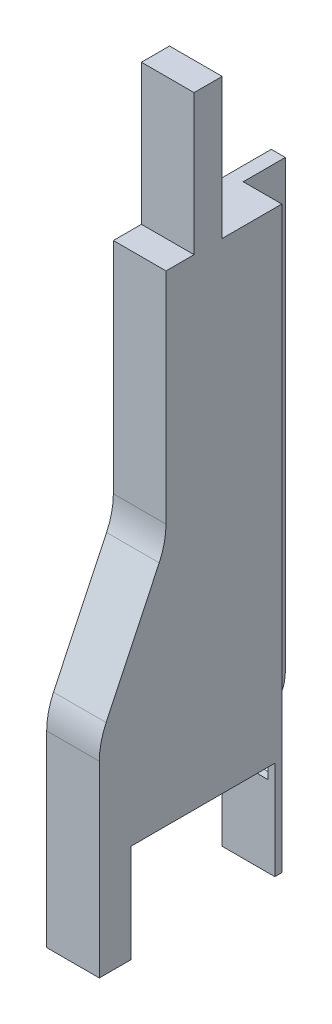
ISO-10303-21;
HEADER;
FILE_DESCRIPTION(('STEP AP214'),'2;1');
FILE_NAME('part.step','',(''),(''),'','','');
FILE_SCHEMA(('AUTOMOTIVE_DESIGN { 1 0 10303 214 1 1 1 1 }'));
ENDSEC;
DATA;
#1=APPLICATION_CONTEXT('core data for automotive mechanical design processes');
#2=APPLICATION_PROTOCOL_DEFINITION('international standard','automotive_design',2000,#1);
#3=PRODUCT_CONTEXT('',#1,'mechanical');
#4=PRODUCT('Part','Part','',(#3));
#5=PRODUCT_RELATED_PRODUCT_CATEGORY('part','',(#4));
#6=PRODUCT_DEFINITION_FORMATION('','',#4);
#7=PRODUCT_DEFINITION_CONTEXT('part definition',#1,'design');
#8=PRODUCT_DEFINITION('design','',#6,#7);
#9=PRODUCT_DEFINITION_SHAPE('','',#8);
#10=(LENGTH_UNIT() NAMED_UNIT(*) SI_UNIT(.MILLI.,.METRE.));
#11=(NAMED_UNIT(*) PLANE_ANGLE_UNIT() SI_UNIT($,.RADIAN.));
#12=(NAMED_UNIT(*) SI_UNIT($,.STERADIAN.) SOLID_ANGLE_UNIT());
#13=UNCERTAINTY_MEASURE_WITH_UNIT(LENGTH_MEASURE(1.E-05),#10,'distance_accuracy_value','');
#14=(GEOMETRIC_REPRESENTATION_CONTEXT(3) GLOBAL_UNCERTAINTY_ASSIGNED_CONTEXT((#13)) GLOBAL_UNIT_ASSIGNED_CONTEXT((#10,
#11,#12)) REPRESENTATION_CONTEXT('',''));
#15=CARTESIAN_POINT('',(0.,0.,0.));
#16=DIRECTION('',(0.,0.,1.));
#17=DIRECTION('',(1.,0.,0.));
#18=AXIS2_PLACEMENT_3D('',#15,#16,#17);
#19=CARTESIAN_POINT('',(0.,0.,26.));
#20=DIRECTION('',(0.,0.,1.));
#21=DIRECTION('',(1.,0.,0.));
#22=AXIS2_PLACEMENT_3D('',#19,#20,#21);
#23=PLANE('',#22);
#24=DIRECTION('',(0.,-1.,0.));
#25=VECTOR('',#24,1.);
#26=CARTESIAN_POINT('',(183.,0.,26.));
#27=LINE('',#26,#25);
#28=CARTESIAN_POINT('',(183.,-203.,26.));
#29=VERTEX_POINT('',#28);
#30=CARTESIAN_POINT('',(183.,-265.491389841085,26.));
#31=VERTEX_POINT('',#30);
#32=EDGE_CURVE('E226',#29,#31,#27,.T.);
#33=ORIENTED_EDGE('',*,*,#32,.F.);
#34=DIRECTION('',(-1.,0.,0.));
#35=VECTOR('',#34,1.);
#36=CARTESIAN_POINT('',(205.,-203.,26.));
#37=LINE('',#36,#35);
#38=CARTESIAN_POINT('',(168.,-203.,26.));
#39=VERTEX_POINT('',#38);
#40=EDGE_CURVE('E298',#29,#39,#37,.T.);
#41=ORIENTED_EDGE('',*,*,#40,.T.);
#42=DIRECTION('',(0.,-1.,0.));
#43=VECTOR('',#42,1.);
#44=CARTESIAN_POINT('',(168.,-19.9999999999999,26.));
#45=LINE('',#44,#43);
#46=CARTESIAN_POINT('',(168.,-265.491389841085,26.));
#47=VERTEX_POINT('',#46);
#48=EDGE_CURVE('E233',#39,#47,#45,.T.);
#49=ORIENTED_EDGE('',*,*,#48,.T.);
#50=DIRECTION('',(1.,0.,0.));
#51=VECTOR('',#50,1.);
#52=CARTESIAN_POINT('',(0.,-265.491389841085,26.));
#53=LINE('',#52,#51);
#54=EDGE_CURVE('E244',#47,#31,#53,.T.);
#55=ORIENTED_EDGE('',*,*,#54,.T.);
#56=EDGE_LOOP('',(#33,#41,#49,#55));
#57=FACE_BOUND('',#56,.T.);
#58=ADVANCED_FACE('F35',(#57),#23,.T.);
#59=CARTESIAN_POINT('',(168.,-19.9999999999999,26.));
#60=DIRECTION('',(1.,0.,0.));
#61=DIRECTION('',(0.,1.,0.));
#62=AXIS2_PLACEMENT_3D('',#59,#60,#61);
#63=PLANE('',#62);
#64=DIRECTION('',(0.,0.,-1.));
#65=VECTOR('',#64,1.);
#66=CARTESIAN_POINT('',(168.,-203.,0.));
#67=LINE('',#66,#65);
#68=CARTESIAN_POINT('',(168.,-203.,18.));
#69=VERTEX_POINT('',#68);
#70=EDGE_CURVE('E208',#39,#69,#67,.T.);
#71=ORIENTED_EDGE('',*,*,#70,.T.);
#72=DIRECTION('',(0.,1.,0.));
#73=VECTOR('',#72,1.);
#74=CARTESIAN_POINT('',(168.,0.,18.));
#75=LINE('',#74,#73);
#76=CARTESIAN_POINT('',(168.,-163.,18.));
#77=VERTEX_POINT('',#76);
#78=EDGE_CURVE('E497',#69,#77,#75,.T.);
#79=ORIENTED_EDGE('',*,*,#78,.T.);
#80=DIRECTION('',(0.,0.,-1.));
#81=VECTOR('',#80,1.);
#82=CARTESIAN_POINT('',(168.,-163.,0.));
#83=LINE('',#82,#81);
#84=CARTESIAN_POINT('',(168.,-163.,10.));
#85=VERTEX_POINT('',#84);
#86=EDGE_CURVE('E294',#77,#85,#83,.T.);
#87=ORIENTED_EDGE('',*,*,#86,.T.);
#88=DIRECTION('',(0.,-1.,0.));
#89=VECTOR('',#88,1.);
#90=CARTESIAN_POINT('',(168.,0.,9.99999999999998));
#91=LINE('',#90,#89);
#92=CARTESIAN_POINT('',(168.,-203.,10.));
#93=VERTEX_POINT('',#92);
#94=EDGE_CURVE('E218',#85,#93,#91,.T.);
#95=ORIENTED_EDGE('',*,*,#94,.T.);
#96=DIRECTION('',(0.,0.,-1.));
#97=VECTOR('',#96,1.);
#98=CARTESIAN_POINT('',(168.,-203.,0.));
#99=LINE('',#98,#97);
#100=CARTESIAN_POINT('',(168.,-203.,-19.));
#101=VERTEX_POINT('',#100);
#102=EDGE_CURVE('E200',#93,#101,#99,.T.);
#103=ORIENTED_EDGE('',*,*,#102,.T.);
#104=DIRECTION('',(0.,1.,0.));
#105=VECTOR('',#104,1.);
#106=CARTESIAN_POINT('',(168.,0.,-19.));
#107=LINE('',#106,#105);
#108=CARTESIAN_POINT('',(168.,-330.,-19.));
#109=VERTEX_POINT('',#108);
#110=EDGE_CURVE('E215',#109,#101,#107,.T.);
#111=ORIENTED_EDGE('',*,*,#110,.F.);
#112=CARTESIAN_POINT('',(168.,-330.,-9.));
#113=DIRECTION('',(1.,0.,0.));
#114=DIRECTION('',(0.,1.,0.));
#115=AXIS2_PLACEMENT_3D('',#112,#113,#114);
#116=CIRCLE('',#115,10.);
#117=CARTESIAN_POINT('',(168.,-338.,-15.));
#118=VERTEX_POINT('',#117);
#119=EDGE_CURVE('E242',#109,#118,#116,.F.);
#120=ORIENTED_EDGE('',*,*,#119,.T.);
#121=CARTESIAN_POINT('',(168.,-354.,-27.));
#122=DIRECTION('',(1.,0.,0.));
#123=DIRECTION('',(0.,1.,0.));
#124=AXIS2_PLACEMENT_3D('',#121,#122,#123);
#125=CIRCLE('',#124,20.);
#126=CARTESIAN_POINT('',(168.,-354.,-7.));
#127=VERTEX_POINT('',#126);
#128=EDGE_CURVE('E268',#118,#127,#125,.T.);
#129=ORIENTED_EDGE('',*,*,#128,.T.);
#130=DIRECTION('',(0.,1.,0.));
#131=VECTOR('',#130,1.);
#132=CARTESIAN_POINT('',(168.,-368.,-7.));
#133=LINE('',#132,#131);
#134=CARTESIAN_POINT('',(168.,-368.,-7.));
#135=VERTEX_POINT('',#134);
#136=EDGE_CURVE('E377',#135,#127,#133,.T.);
#137=ORIENTED_EDGE('',*,*,#136,.F.);
#138=DIRECTION('',(0.,0.,1.));
#139=VECTOR('',#138,1.);
#140=CARTESIAN_POINT('',(168.,-368.,0.));
#141=LINE('',#140,#139);
#142=CARTESIAN_POINT('',(168.,-368.,-5.));
#143=VERTEX_POINT('',#142);
#144=EDGE_CURVE('E374',#135,#143,#141,.T.);
#145=ORIENTED_EDGE('',*,*,#144,.T.);
#146=DIRECTION('',(0.,1.,0.));
#147=VECTOR('',#146,1.);
#148=CARTESIAN_POINT('',(168.,-368.,-5.));
#149=LINE('',#148,#147);
#150=CARTESIAN_POINT('',(168.,-340.,-5.));
#151=VERTEX_POINT('',#150);
#152=EDGE_CURVE('E382',#143,#151,#149,.T.);
#153=ORIENTED_EDGE('',*,*,#152,.T.);
#154=DIRECTION('',(0.,0.,-1.));
#155=VECTOR('',#154,1.);
#156=CARTESIAN_POINT('',(168.,-340.,26.));
#157=LINE('',#156,#155);
#158=CARTESIAN_POINT('',(168.,-340.,36.));
#159=VERTEX_POINT('',#158);
#160=EDGE_CURVE('E236',#159,#151,#157,.T.);
#161=ORIENTED_EDGE('',*,*,#160,.F.);
#162=DIRECTION('',(0.,1.,0.));
#163=VECTOR('',#162,1.);
#164=CARTESIAN_POINT('',(168.,-368.,36.));
#165=LINE('',#164,#163);
#166=CARTESIAN_POINT('',(168.,-368.,36.));
#167=VERTEX_POINT('',#166);
#168=EDGE_CURVE('E328',#167,#159,#165,.T.);
#169=ORIENTED_EDGE('',*,*,#168,.F.);
#170=DIRECTION('',(0.,0.,1.));
#171=VECTOR('',#170,1.);
#172=CARTESIAN_POINT('',(168.,-368.,0.));
#173=LINE('',#172,#171);
#174=CARTESIAN_POINT('',(168.,-368.,45.));
#175=VERTEX_POINT('',#174);
#176=EDGE_CURVE('E316',#167,#175,#173,.T.);
#177=ORIENTED_EDGE('',*,*,#176,.T.);
#178=DIRECTION('',(0.,-1.,0.));
#179=VECTOR('',#178,1.);
#180=CARTESIAN_POINT('',(168.,-310.,45.));
#181=LINE('',#180,#179);
#182=CARTESIAN_POINT('',(168.,-314.508610158915,45.));
#183=VERTEX_POINT('',#182);
#184=EDGE_CURVE('E331',#183,#175,#181,.T.);
#185=ORIENTED_EDGE('',*,*,#184,.F.);
#186=CARTESIAN_POINT('',(168.,-314.508610158915,25.));
#187=DIRECTION('',(1.,0.,0.));
#188=DIRECTION('',(0.,1.,0.));
#189=AXIS2_PLACEMENT_3D('',#186,#187,#188);
#190=CIRCLE('',#189,20.);
#191=CARTESIAN_POINT('',(168.,-305.927473867549,43.0655500870858));
#192=VERTEX_POINT('',#191);
#193=EDGE_CURVE('E256',#183,#192,#190,.F.);
#194=ORIENTED_EDGE('',*,*,#193,.T.);
#195=DIRECTION('',(0.,0.90327750435429,-0.429056814568288));
#196=VECTOR('',#195,1.);
#197=CARTESIAN_POINT('',(168.,-39.6277409484958,-83.4268230494646));
#198=LINE('',#197,#196);
#199=CARTESIAN_POINT('',(168.,-274.072526132451,27.9344499129142));
#200=VERTEX_POINT('',#199);
#201=EDGE_CURVE('E307',#192,#200,#198,.T.);
#202=ORIENTED_EDGE('',*,*,#201,.T.);
#203=CARTESIAN_POINT('',(168.,-265.491389841085,46.));
#204=DIRECTION('',(1.,0.,0.));
#205=DIRECTION('',(0.,1.,0.));
#206=AXIS2_PLACEMENT_3D('',#203,#204,#205);
#207=CIRCLE('',#206,20.);
#208=EDGE_CURVE('E260',#200,#47,#207,.T.);
#209=ORIENTED_EDGE('',*,*,#208,.T.);
#210=ORIENTED_EDGE('',*,*,#48,.F.);
#211=EDGE_LOOP('',(#71,#79,#87,#95,#103,#111,#120,#129,#137,#145,#153,#161,#169,#177,#185,#194,
#202,#209,#210));
#212=FACE_BOUND('',#211,.T.);
#213=ADVANCED_FACE('F213',(#212),#63,.F.);
#214=CARTESIAN_POINT('',(183.,0.,26.));
#215=DIRECTION('',(1.,0.,0.));
#216=DIRECTION('',(0.,1.,0.));
#217=AXIS2_PLACEMENT_3D('',#214,#215,#216);
#218=PLANE('',#217);
#219=DIRECTION('',(0.,-1.,0.));
#220=VECTOR('',#219,1.);
#221=CARTESIAN_POINT('',(183.,0.,18.));
#222=LINE('',#221,#220);
#223=CARTESIAN_POINT('',(183.,-163.,18.));
#224=VERTEX_POINT('',#223);
#225=CARTESIAN_POINT('',(183.,-203.,18.));
#226=VERTEX_POINT('',#225);
#227=EDGE_CURVE('E43',#224,#226,#222,.T.);
#228=ORIENTED_EDGE('',*,*,#227,.T.);
#229=DIRECTION('',(0.,0.,1.));
#230=VECTOR('',#229,1.);
#231=CARTESIAN_POINT('',(183.,-203.,26.));
#232=LINE('',#231,#230);
#233=EDGE_CURVE('E11',#226,#29,#232,.T.);
#234=ORIENTED_EDGE('',*,*,#233,.T.);
#235=ORIENTED_EDGE('',*,*,#32,.T.);
#236=CARTESIAN_POINT('',(183.,-265.491389841085,46.));
#237=DIRECTION('',(1.,0.,0.));
#238=DIRECTION('',(0.,1.,0.));
#239=AXIS2_PLACEMENT_3D('',#236,#237,#238);
#240=CIRCLE('',#239,20.);
#241=CARTESIAN_POINT('',(183.,-274.072526132451,27.9344499129142));
#242=VERTEX_POINT('',#241);
#243=EDGE_CURVE('E258',#31,#242,#240,.F.);
#244=ORIENTED_EDGE('',*,*,#243,.T.);
#245=DIRECTION('',(0.,0.90327750435429,-0.429056814568288));
#246=VECTOR('',#245,1.);
#247=CARTESIAN_POINT('',(183.,-39.6277409484958,-83.4268230494646));
#248=LINE('',#247,#246);
#249=CARTESIAN_POINT('',(183.,-305.927473867549,43.0655500870858));
#250=VERTEX_POINT('',#249);
#251=EDGE_CURVE('E306',#250,#242,#248,.T.);
#252=ORIENTED_EDGE('',*,*,#251,.F.);
#253=CARTESIAN_POINT('',(183.,-314.508610158915,25.));
#254=DIRECTION('',(1.,0.,0.));
#255=DIRECTION('',(0.,1.,0.));
#256=AXIS2_PLACEMENT_3D('',#253,#254,#255);
#257=CIRCLE('',#256,20.);
#258=CARTESIAN_POINT('',(183.,-314.508610158915,45.));
#259=VERTEX_POINT('',#258);
#260=EDGE_CURVE('E252',#250,#259,#257,.T.);
#261=ORIENTED_EDGE('',*,*,#260,.T.);
#262=DIRECTION('',(0.,-1.,0.));
#263=VECTOR('',#262,1.);
#264=CARTESIAN_POINT('',(183.,-310.,45.));
#265=LINE('',#264,#263);
#266=CARTESIAN_POINT('',(183.,-368.,45.));
#267=VERTEX_POINT('',#266);
#268=EDGE_CURVE('E330',#259,#267,#265,.T.);
#269=ORIENTED_EDGE('',*,*,#268,.T.);
#270=DIRECTION('',(0.,0.,-1.));
#271=VECTOR('',#270,1.);
#272=CARTESIAN_POINT('',(183.,-368.,0.));
#273=LINE('',#272,#271);
#274=CARTESIAN_POINT('',(183.,-368.,36.));
#275=VERTEX_POINT('',#274);
#276=EDGE_CURVE('E321',#267,#275,#273,.T.);
#277=ORIENTED_EDGE('',*,*,#276,.T.);
#278=DIRECTION('',(0.,1.,0.));
#279=VECTOR('',#278,1.);
#280=CARTESIAN_POINT('',(183.,-368.,36.));
#281=LINE('',#280,#279);
#282=CARTESIAN_POINT('',(183.,-340.,36.));
#283=VERTEX_POINT('',#282);
#284=EDGE_CURVE('E324',#275,#283,#281,.T.);
#285=ORIENTED_EDGE('',*,*,#284,.T.);
#286=DIRECTION('',(0.,0.,-1.));
#287=VECTOR('',#286,1.);
#288=CARTESIAN_POINT('',(183.,-340.,26.));
#289=LINE('',#288,#287);
#290=CARTESIAN_POINT('',(183.,-340.,-5.));
#291=VERTEX_POINT('',#290);
#292=EDGE_CURVE('E235',#283,#291,#289,.T.);
#293=ORIENTED_EDGE('',*,*,#292,.T.);
#294=DIRECTION('',(0.,1.,0.));
#295=VECTOR('',#294,1.);
#296=CARTESIAN_POINT('',(183.,-368.,-5.));
#297=LINE('',#296,#295);
#298=CARTESIAN_POINT('',(183.,-368.,-5.));
#299=VERTEX_POINT('',#298);
#300=EDGE_CURVE('E385',#299,#291,#297,.T.);
#301=ORIENTED_EDGE('',*,*,#300,.F.);
#302=DIRECTION('',(0.,0.,-1.));
#303=VECTOR('',#302,1.);
#304=CARTESIAN_POINT('',(183.,-368.,0.));
#305=LINE('',#304,#303);
#306=CARTESIAN_POINT('',(183.,-368.,-7.));
#307=VERTEX_POINT('',#306);
#308=EDGE_CURVE('E367',#299,#307,#305,.T.);
#309=ORIENTED_EDGE('',*,*,#308,.T.);
#310=DIRECTION('',(0.,-1.,0.));
#311=VECTOR('',#310,1.);
#312=CARTESIAN_POINT('',(183.,0.,-7.));
#313=LINE('',#312,#311);
#314=CARTESIAN_POINT('',(183.,-203.,-7.));
#315=VERTEX_POINT('',#314);
#316=EDGE_CURVE('E228',#315,#307,#313,.T.);
#317=ORIENTED_EDGE('',*,*,#316,.F.);
#318=DIRECTION('',(0.,0.,1.));
#319=VECTOR('',#318,1.);
#320=CARTESIAN_POINT('',(183.,-203.,26.));
#321=LINE('',#320,#319);
#322=CARTESIAN_POINT('',(183.,-203.,10.));
#323=VERTEX_POINT('',#322);
#324=EDGE_CURVE('E50',#315,#323,#321,.T.);
#325=ORIENTED_EDGE('',*,*,#324,.T.);
#326=DIRECTION('',(0.,1.,0.));
#327=VECTOR('',#326,1.);
#328=CARTESIAN_POINT('',(183.,0.,9.99999999999998));
#329=LINE('',#328,#327);
#330=CARTESIAN_POINT('',(183.,-163.,10.));
#331=VERTEX_POINT('',#330);
#332=EDGE_CURVE('E274',#323,#331,#329,.T.);
#333=ORIENTED_EDGE('',*,*,#332,.T.);
#334=DIRECTION('',(0.,0.,1.));
#335=VECTOR('',#334,1.);
#336=CARTESIAN_POINT('',(183.,-163.,26.));
#337=LINE('',#336,#335);
#338=EDGE_CURVE('E277',#331,#224,#337,.T.);
#339=ORIENTED_EDGE('',*,*,#338,.T.);
#340=EDGE_LOOP('',(#228,#234,#235,#244,#252,#261,#269,#277,#285,#293,#301,#309,#317,#325,#333,#339));
#341=FACE_BOUND('',#340,.T.);
#342=ADVANCED_FACE('F281',(#341),#218,.T.);
#343=CARTESIAN_POINT('',(172.,0.,-19.));
#344=DIRECTION('',(1.,0.,0.));
#345=DIRECTION('',(0.,1.,0.));
#346=AXIS2_PLACEMENT_3D('',#343,#344,#345);
#347=PLANE('',#346);
#348=DIRECTION('',(0.,1.,0.));
#349=VECTOR('',#348,1.);
#350=CARTESIAN_POINT('',(172.,0.,-19.));
#351=LINE('',#350,#349);
#352=CARTESIAN_POINT('',(172.,-330.,-19.));
#353=VERTEX_POINT('',#352);
#354=CARTESIAN_POINT('',(172.,-203.,-19.));
#355=VERTEX_POINT('',#354);
#356=EDGE_CURVE('E224',#353,#355,#351,.T.);
#357=ORIENTED_EDGE('',*,*,#356,.T.);
#358=DIRECTION('',(0.,0.,1.));
#359=VECTOR('',#358,1.);
#360=CARTESIAN_POINT('',(172.,-203.,-19.));
#361=LINE('',#360,#359);
#362=CARTESIAN_POINT('',(172.,-203.,-7.));
#363=VERTEX_POINT('',#362);
#364=EDGE_CURVE('E202',#355,#363,#361,.T.);
#365=ORIENTED_EDGE('',*,*,#364,.T.);
#366=DIRECTION('',(0.,1.,0.));
#367=VECTOR('',#366,1.);
#368=CARTESIAN_POINT('',(172.,0.,-7.));
#369=LINE('',#368,#367);
#370=CARTESIAN_POINT('',(172.,-354.,-7.));
#371=VERTEX_POINT('',#370);
#372=EDGE_CURVE('E58',#371,#363,#369,.T.);
#373=ORIENTED_EDGE('',*,*,#372,.F.);
#374=CARTESIAN_POINT('',(172.,-354.,-27.));
#375=DIRECTION('',(1.,0.,0.));
#376=DIRECTION('',(0.,1.,0.));
#377=AXIS2_PLACEMENT_3D('',#374,#375,#376);
#378=CIRCLE('',#377,20.);
#379=CARTESIAN_POINT('',(172.,-338.,-15.));
#380=VERTEX_POINT('',#379);
#381=EDGE_CURVE('E270',#371,#380,#378,.F.);
#382=ORIENTED_EDGE('',*,*,#381,.T.);
#383=CARTESIAN_POINT('',(172.,-330.,-9.));
#384=DIRECTION('',(1.,0.,0.));
#385=DIRECTION('',(0.,1.,0.));
#386=AXIS2_PLACEMENT_3D('',#383,#384,#385);
#387=CIRCLE('',#386,10.);
#388=EDGE_CURVE('E240',#380,#353,#387,.T.);
#389=ORIENTED_EDGE('',*,*,#388,.T.);
#390=EDGE_LOOP('',(#357,#365,#373,#382,#389));
#391=FACE_BOUND('',#390,.T.);
#392=ADVANCED_FACE('F409',(#391),#347,.T.);
#393=CARTESIAN_POINT('',(0.,0.,-19.));
#394=DIRECTION('',(0.,0.,1.));
#395=DIRECTION('',(1.,0.,0.));
#396=AXIS2_PLACEMENT_3D('',#393,#394,#395);
#397=PLANE('',#396);
#398=DIRECTION('',(-1.,0.,0.));
#399=VECTOR('',#398,1.);
#400=CARTESIAN_POINT('',(205.,-203.,-19.));
#401=LINE('',#400,#399);
#402=EDGE_CURVE('E197',#355,#101,#401,.T.);
#403=ORIENTED_EDGE('',*,*,#402,.F.);
#404=ORIENTED_EDGE('',*,*,#356,.F.);
#405=DIRECTION('',(-1.,0.,0.));
#406=VECTOR('',#405,1.);
#407=CARTESIAN_POINT('',(168.,-330.,-19.));
#408=LINE('',#407,#406);
#409=EDGE_CURVE('E223',#353,#109,#408,.T.);
#410=ORIENTED_EDGE('',*,*,#409,.T.);
#411=ORIENTED_EDGE('',*,*,#110,.T.);
#412=EDGE_LOOP('',(#403,#404,#410,#411));
#413=FACE_BOUND('',#412,.T.);
#414=ADVANCED_FACE('F221',(#413),#397,.F.);
#415=CARTESIAN_POINT('',(0.,0.,-7.));
#416=DIRECTION('',(0.,0.,1.));
#417=DIRECTION('',(1.,0.,0.));
#418=AXIS2_PLACEMENT_3D('',#415,#416,#417);
#419=PLANE('',#418);
#420=DIRECTION('',(0.,1.,0.));
#421=VECTOR('',#420,1.);
#422=CARTESIAN_POINT('',(174.5,-345.,-7.));
#423=LINE('',#422,#421);
#424=CARTESIAN_POINT('',(174.5,-345.,-7.));
#425=VERTEX_POINT('',#424);
#426=CARTESIAN_POINT('',(174.5,-340.,-7.));
#427=VERTEX_POINT('',#426);
#428=EDGE_CURVE('E357',#425,#427,#423,.T.);
#429=ORIENTED_EDGE('',*,*,#428,.F.);
#430=DIRECTION('',(-1.,0.,0.));
#431=VECTOR('',#430,1.);
#432=CARTESIAN_POINT('',(0.,-345.,-7.));
#433=LINE('',#432,#431);
#434=CARTESIAN_POINT('',(181.1,-345.,-7.));
#435=VERTEX_POINT('',#434);
#436=EDGE_CURVE('E341',#435,#425,#433,.T.);
#437=ORIENTED_EDGE('',*,*,#436,.F.);
#438=DIRECTION('',(0.,1.,0.));
#439=VECTOR('',#438,1.);
#440=CARTESIAN_POINT('',(181.1,-345.,-7.));
#441=LINE('',#440,#439);
#442=CARTESIAN_POINT('',(181.1,-340.,-7.));
#443=VERTEX_POINT('',#442);
#444=EDGE_CURVE('E354',#435,#443,#441,.T.);
#445=ORIENTED_EDGE('',*,*,#444,.T.);
#446=DIRECTION('',(-1.,0.,0.));
#447=VECTOR('',#446,1.);
#448=CARTESIAN_POINT('',(0.,-340.,-7.));
#449=LINE('',#448,#447);
#450=EDGE_CURVE('E348',#443,#427,#449,.T.);
#451=ORIENTED_EDGE('',*,*,#450,.T.);
#452=EDGE_LOOP('',(#429,#437,#445,#451));
#453=FACE_BOUND('',#452,.T.);
#454=DIRECTION('',(-1.,0.,0.));
#455=VECTOR('',#454,1.);
#456=CARTESIAN_POINT('',(0.,-203.,-7.));
#457=LINE('',#456,#455);
#458=EDGE_CURVE('E272',#315,#363,#457,.T.);
#459=ORIENTED_EDGE('',*,*,#458,.F.);
#460=ORIENTED_EDGE('',*,*,#316,.T.);
#461=DIRECTION('',(-1.,0.,0.));
#462=VECTOR('',#461,1.);
#463=CARTESIAN_POINT('',(0.,-368.,-7.));
#464=LINE('',#463,#462);
#465=EDGE_CURVE('E364',#307,#135,#464,.T.);
#466=ORIENTED_EDGE('',*,*,#465,.T.);
#467=ORIENTED_EDGE('',*,*,#136,.T.);
#468=DIRECTION('',(1.,0.,0.));
#469=VECTOR('',#468,1.);
#470=CARTESIAN_POINT('',(0.,-354.,-7.));
#471=LINE('',#470,#469);
#472=EDGE_CURVE('E266',#127,#371,#471,.T.);
#473=ORIENTED_EDGE('',*,*,#472,.T.);
#474=ORIENTED_EDGE('',*,*,#372,.T.);
#475=EDGE_LOOP('',(#459,#460,#466,#467,#473,#474));
#476=FACE_BOUND('',#475,.T.);
#477=ADVANCED_FACE('F390',(#453,#476),#419,.F.);
#478=CARTESIAN_POINT('',(183.,-340.,26.));
#479=DIRECTION('',(0.,-1.,0.));
#480=DIRECTION('',(0.,0.,-1.));
#481=AXIS2_PLACEMENT_3D('',#478,#479,#480);
#482=PLANE('',#481);
#483=ORIENTED_EDGE('',*,*,#292,.F.);
#484=DIRECTION('',(1.,0.,0.));
#485=VECTOR('',#484,1.);
#486=CARTESIAN_POINT('',(0.,-340.,36.));
#487=LINE('',#486,#485);
#488=EDGE_CURVE('E310',#159,#283,#487,.T.);
#489=ORIENTED_EDGE('',*,*,#488,.F.);
#490=ORIENTED_EDGE('',*,*,#160,.T.);
#491=DIRECTION('',(1.,0.,0.));
#492=VECTOR('',#491,1.);
#493=CARTESIAN_POINT('',(0.,-340.,-4.99999999999992));
#494=LINE('',#493,#492);
#495=CARTESIAN_POINT('',(174.5,-340.,-5.));
#496=VERTEX_POINT('',#495);
#497=EDGE_CURVE('E368',#151,#496,#494,.T.);
#498=ORIENTED_EDGE('',*,*,#497,.T.);
#499=DIRECTION('',(0.,0.,-1.));
#500=VECTOR('',#499,1.);
#501=CARTESIAN_POINT('',(174.5,-340.,0.));
#502=LINE('',#501,#500);
#503=EDGE_CURVE('E333',#496,#427,#502,.T.);
#504=ORIENTED_EDGE('',*,*,#503,.T.);
#505=ORIENTED_EDGE('',*,*,#450,.F.);
#506=DIRECTION('',(0.,0.,1.));
#507=VECTOR('',#506,1.);
#508=CARTESIAN_POINT('',(181.1,-340.,0.));
#509=LINE('',#508,#507);
#510=CARTESIAN_POINT('',(181.1,-340.,-5.));
#511=VERTEX_POINT('',#510);
#512=EDGE_CURVE('E339',#443,#511,#509,.T.);
#513=ORIENTED_EDGE('',*,*,#512,.T.);
#514=EDGE_CURVE('E363',#511,#291,#494,.T.);
#515=ORIENTED_EDGE('',*,*,#514,.T.);
#516=EDGE_LOOP('',(#483,#489,#490,#498,#504,#505,#513,#515));
#517=FACE_BOUND('',#516,.T.);
#518=ADVANCED_FACE('F420',(#517),#482,.T.);
#519=CARTESIAN_POINT('',(0.,-368.,-4.99999999999992));
#520=DIRECTION('',(0.,0.,1.));
#521=DIRECTION('',(1.,0.,0.));
#522=AXIS2_PLACEMENT_3D('',#519,#520,#521);
#523=PLANE('',#522);
#524=DIRECTION('',(-1.,0.,0.));
#525=VECTOR('',#524,1.);
#526=CARTESIAN_POINT('',(0.,-345.,-5.00000000000002));
#527=LINE('',#526,#525);
#528=CARTESIAN_POINT('',(181.1,-345.,-5.));
#529=VERTEX_POINT('',#528);
#530=CARTESIAN_POINT('',(174.5,-345.,-5.));
#531=VERTEX_POINT('',#530);
#532=EDGE_CURVE('E335',#529,#531,#527,.T.);
#533=ORIENTED_EDGE('',*,*,#532,.T.);
#534=DIRECTION('',(0.,1.,0.));
#535=VECTOR('',#534,1.);
#536=CARTESIAN_POINT('',(174.5,-345.,-5.));
#537=LINE('',#536,#535);
#538=EDGE_CURVE('E360',#531,#496,#537,.T.);
#539=ORIENTED_EDGE('',*,*,#538,.T.);
#540=ORIENTED_EDGE('',*,*,#497,.F.);
#541=ORIENTED_EDGE('',*,*,#152,.F.);
#542=DIRECTION('',(1.,0.,0.));
#543=VECTOR('',#542,1.);
#544=CARTESIAN_POINT('',(0.,-368.,-4.99999999999992));
#545=LINE('',#544,#543);
#546=EDGE_CURVE('E371',#143,#299,#545,.T.);
#547=ORIENTED_EDGE('',*,*,#546,.T.);
#548=ORIENTED_EDGE('',*,*,#300,.T.);
#549=ORIENTED_EDGE('',*,*,#514,.F.);
#550=DIRECTION('',(0.,1.,0.));
#551=VECTOR('',#550,1.);
#552=CARTESIAN_POINT('',(181.1,-345.,-5.));
#553=LINE('',#552,#551);
#554=EDGE_CURVE('E346',#529,#511,#553,.T.);
#555=ORIENTED_EDGE('',*,*,#554,.F.);
#556=EDGE_LOOP('',(#533,#539,#540,#541,#547,#548,#549,#555));
#557=FACE_BOUND('',#556,.T.);
#558=ADVANCED_FACE('F400',(#557),#523,.T.);
#559=CARTESIAN_POINT('',(0.,-330.,-9.));
#560=DIRECTION('',(1.,0.,0.));
#561=DIRECTION('',(0.,0.,-1.));
#562=AXIS2_PLACEMENT_3D('',#559,#560,#561);
#563=CYLINDRICAL_SURFACE('',#562,10.);
#564=ORIENTED_EDGE('',*,*,#388,.F.);
#565=DIRECTION('',(1.,0.,0.));
#566=VECTOR('',#565,1.);
#567=CARTESIAN_POINT('',(0.,-338.,-15.));
#568=LINE('',#567,#566);
#569=EDGE_CURVE('E263',#380,#118,#568,.F.);
#570=ORIENTED_EDGE('',*,*,#569,.T.);
#571=ORIENTED_EDGE('',*,*,#119,.F.);
#572=ORIENTED_EDGE('',*,*,#409,.F.);
#573=EDGE_LOOP('',(#564,#570,#571,#572));
#574=FACE_BOUND('',#573,.T.);
#575=ADVANCED_FACE('F411',(#574),#563,.T.);
#576=CARTESIAN_POINT('',(0.,-368.,0.));
#577=DIRECTION('',(0.,-1.,0.));
#578=DIRECTION('',(0.,0.,-1.));
#579=AXIS2_PLACEMENT_3D('',#576,#577,#578);
#580=PLANE('',#579);
#581=ORIENTED_EDGE('',*,*,#465,.F.);
#582=ORIENTED_EDGE('',*,*,#308,.F.);
#583=ORIENTED_EDGE('',*,*,#546,.F.);
#584=ORIENTED_EDGE('',*,*,#144,.F.);
#585=EDGE_LOOP('',(#581,#582,#583,#584));
#586=FACE_BOUND('',#585,.T.);
#587=ADVANCED_FACE('F394',(#586),#580,.T.);
#588=CARTESIAN_POINT('',(174.5,-345.,0.));
#589=DIRECTION('',(1.,0.,0.));
#590=DIRECTION('',(0.,0.,-1.));
#591=AXIS2_PLACEMENT_3D('',#588,#589,#590);
#592=PLANE('',#591);
#593=ORIENTED_EDGE('',*,*,#503,.F.);
#594=ORIENTED_EDGE('',*,*,#538,.F.);
#595=DIRECTION('',(0.,0.,-1.));
#596=VECTOR('',#595,1.);
#597=CARTESIAN_POINT('',(174.5,-345.,0.));
#598=LINE('',#597,#596);
#599=EDGE_CURVE('E338',#531,#425,#598,.T.);
#600=ORIENTED_EDGE('',*,*,#599,.T.);
#601=ORIENTED_EDGE('',*,*,#428,.T.);
#602=EDGE_LOOP('',(#593,#594,#600,#601));
#603=FACE_BOUND('',#602,.T.);
#604=ADVANCED_FACE('F418',(#603),#592,.T.);
#605=CARTESIAN_POINT('',(181.1,-345.,0.));
#606=DIRECTION('',(-1.,0.,0.));
#607=DIRECTION('',(0.,0.,1.));
#608=AXIS2_PLACEMENT_3D('',#605,#606,#607);
#609=PLANE('',#608);
#610=ORIENTED_EDGE('',*,*,#512,.F.);
#611=ORIENTED_EDGE('',*,*,#444,.F.);
#612=DIRECTION('',(0.,0.,1.));
#613=VECTOR('',#612,1.);
#614=CARTESIAN_POINT('',(181.1,-345.,0.));
#615=LINE('',#614,#613);
#616=EDGE_CURVE('E344',#435,#529,#615,.T.);
#617=ORIENTED_EDGE('',*,*,#616,.T.);
#618=ORIENTED_EDGE('',*,*,#554,.T.);
#619=EDGE_LOOP('',(#610,#611,#617,#618));
#620=FACE_BOUND('',#619,.T.);
#621=ADVANCED_FACE('F453',(#620),#609,.T.);
#622=CARTESIAN_POINT('',(0.,-345.,0.));
#623=DIRECTION('',(0.,-1.,0.));
#624=DIRECTION('',(0.,0.,-1.));
#625=AXIS2_PLACEMENT_3D('',#622,#623,#624);
#626=PLANE('',#625);
#627=ORIENTED_EDGE('',*,*,#532,.F.);
#628=ORIENTED_EDGE('',*,*,#616,.F.);
#629=ORIENTED_EDGE('',*,*,#436,.T.);
#630=ORIENTED_EDGE('',*,*,#599,.F.);
#631=EDGE_LOOP('',(#627,#628,#629,#630));
#632=FACE_BOUND('',#631,.T.);
#633=ADVANCED_FACE('F457',(#632),#626,.F.);
#634=CARTESIAN_POINT('',(0.,-310.,45.));
#635=DIRECTION('',(0.,0.,-1.));
#636=DIRECTION('',(-1.,0.,0.));
#637=AXIS2_PLACEMENT_3D('',#634,#635,#636);
#638=PLANE('',#637);
#639=ORIENTED_EDGE('',*,*,#268,.F.);
#640=DIRECTION('',(1.,0.,0.));
#641=VECTOR('',#640,1.);
#642=CARTESIAN_POINT('',(0.,-314.508610158915,45.));
#643=LINE('',#642,#641);
#644=EDGE_CURVE('E254',#259,#183,#643,.F.);
#645=ORIENTED_EDGE('',*,*,#644,.T.);
#646=ORIENTED_EDGE('',*,*,#184,.T.);
#647=DIRECTION('',(1.,0.,0.));
#648=VECTOR('',#647,1.);
#649=CARTESIAN_POINT('',(0.,-368.,45.));
#650=LINE('',#649,#648);
#651=EDGE_CURVE('E313',#175,#267,#650,.T.);
#652=ORIENTED_EDGE('',*,*,#651,.T.);
#653=EDGE_LOOP('',(#639,#645,#646,#652));
#654=FACE_BOUND('',#653,.T.);
#655=ADVANCED_FACE('F461',(#654),#638,.F.);
#656=CARTESIAN_POINT('',(0.,-368.,36.));
#657=DIRECTION('',(0.,0.,1.));
#658=DIRECTION('',(1.,0.,0.));
#659=AXIS2_PLACEMENT_3D('',#656,#657,#658);
#660=PLANE('',#659);
#661=ORIENTED_EDGE('',*,*,#488,.T.);
#662=ORIENTED_EDGE('',*,*,#284,.F.);
#663=DIRECTION('',(1.,0.,0.));
#664=VECTOR('',#663,1.);
#665=CARTESIAN_POINT('',(0.,-368.,36.));
#666=LINE('',#665,#664);
#667=EDGE_CURVE('E319',#167,#275,#666,.T.);
#668=ORIENTED_EDGE('',*,*,#667,.F.);
#669=ORIENTED_EDGE('',*,*,#168,.T.);
#670=EDGE_LOOP('',(#661,#662,#668,#669));
#671=FACE_BOUND('',#670,.T.);
#672=ADVANCED_FACE('F465',(#671),#660,.F.);
#673=CARTESIAN_POINT('',(0.,-368.,0.));
#674=DIRECTION('',(0.,-1.,0.));
#675=DIRECTION('',(0.,0.,-1.));
#676=AXIS2_PLACEMENT_3D('',#673,#674,#675);
#677=PLANE('',#676);
#678=ORIENTED_EDGE('',*,*,#651,.F.);
#679=ORIENTED_EDGE('',*,*,#176,.F.);
#680=ORIENTED_EDGE('',*,*,#667,.T.);
#681=ORIENTED_EDGE('',*,*,#276,.F.);
#682=EDGE_LOOP('',(#678,#679,#680,#681));
#683=FACE_BOUND('',#682,.T.);
#684=ADVANCED_FACE('F469',(#683),#677,.T.);
#685=CARTESIAN_POINT('',(168.,-39.6277409484958,-83.4268230494646));
#686=DIRECTION('',(0.,-0.429056814568288,-0.90327750435429));
#687=DIRECTION('',(0.,0.90327750435429,-0.429056814568288));
#688=AXIS2_PLACEMENT_3D('',#685,#686,#687);
#689=PLANE('',#688);
#690=ORIENTED_EDGE('',*,*,#251,.T.);
#691=DIRECTION('',(1.,0.,0.));
#692=VECTOR('',#691,1.);
#693=CARTESIAN_POINT('',(168.,-274.072526132451,27.9344499129142));
#694=LINE('',#693,#692);
#695=EDGE_CURVE('E250',#242,#200,#694,.F.);
#696=ORIENTED_EDGE('',*,*,#695,.T.);
#697=ORIENTED_EDGE('',*,*,#201,.F.);
#698=DIRECTION('',(1.,0.,0.));
#699=VECTOR('',#698,1.);
#700=CARTESIAN_POINT('',(168.,-305.927473867549,43.0655500870858));
#701=LINE('',#700,#699);
#702=EDGE_CURVE('E247',#192,#250,#701,.T.);
#703=ORIENTED_EDGE('',*,*,#702,.T.);
#704=EDGE_LOOP('',(#690,#696,#697,#703));
#705=FACE_BOUND('',#704,.T.);
#706=ADVANCED_FACE('F473',(#705),#689,.F.);
#707=CARTESIAN_POINT('',(0.,-265.491389841085,46.));
#708=DIRECTION('',(1.,0.,0.));
#709=DIRECTION('',(0.,1.,0.));
#710=AXIS2_PLACEMENT_3D('',#707,#708,#709);
#711=CYLINDRICAL_SURFACE('',#710,20.);
#712=ORIENTED_EDGE('',*,*,#208,.F.);
#713=ORIENTED_EDGE('',*,*,#695,.F.);
#714=ORIENTED_EDGE('',*,*,#243,.F.);
#715=ORIENTED_EDGE('',*,*,#54,.F.);
#716=EDGE_LOOP('',(#712,#713,#714,#715));
#717=FACE_BOUND('',#716,.T.);
#718=ADVANCED_FACE('F477',(#717),#711,.F.);
#719=CARTESIAN_POINT('',(168.,-314.508610158915,25.));
#720=DIRECTION('',(1.,0.,0.));
#721=DIRECTION('',(0.,1.,0.));
#722=AXIS2_PLACEMENT_3D('',#719,#720,#721);
#723=CYLINDRICAL_SURFACE('',#722,20.);
#724=ORIENTED_EDGE('',*,*,#193,.F.);
#725=ORIENTED_EDGE('',*,*,#644,.F.);
#726=ORIENTED_EDGE('',*,*,#260,.F.);
#727=ORIENTED_EDGE('',*,*,#702,.F.);
#728=EDGE_LOOP('',(#724,#725,#726,#727));
#729=FACE_BOUND('',#728,.T.);
#730=ADVANCED_FACE('F495',(#729),#723,.T.);
#731=CARTESIAN_POINT('',(0.,-354.,-27.));
#732=DIRECTION('',(1.,0.,0.));
#733=DIRECTION('',(0.,0.,-1.));
#734=AXIS2_PLACEMENT_3D('',#731,#732,#733);
#735=CYLINDRICAL_SURFACE('',#734,20.);
#736=ORIENTED_EDGE('',*,*,#381,.F.);
#737=ORIENTED_EDGE('',*,*,#472,.F.);
#738=ORIENTED_EDGE('',*,*,#128,.F.);
#739=ORIENTED_EDGE('',*,*,#569,.F.);
#740=EDGE_LOOP('',(#736,#737,#738,#739));
#741=FACE_BOUND('',#740,.T.);
#742=ADVANCED_FACE('F37',(#741),#735,.F.);
#743=CARTESIAN_POINT('',(205.,-203.,0.));
#744=DIRECTION('',(0.,1.,0.));
#745=DIRECTION('',(-1.,0.,0.));
#746=AXIS2_PLACEMENT_3D('',#743,#744,#745);
#747=PLANE('',#746);
#748=DIRECTION('',(-1.,0.,0.));
#749=VECTOR('',#748,1.);
#750=CARTESIAN_POINT('',(205.,-203.,18.));
#751=LINE('',#750,#749);
#752=EDGE_CURVE('E290',#226,#69,#751,.T.);
#753=ORIENTED_EDGE('',*,*,#752,.T.);
#754=ORIENTED_EDGE('',*,*,#70,.F.);
#755=ORIENTED_EDGE('',*,*,#40,.F.);
#756=ORIENTED_EDGE('',*,*,#233,.F.);
#757=EDGE_LOOP('',(#753,#754,#755,#756));
#758=FACE_BOUND('',#757,.T.);
#759=ADVANCED_FACE('F489',(#758),#747,.T.);
#760=CARTESIAN_POINT('',(205.,0.,18.));
#761=DIRECTION('',(0.,0.,1.));
#762=DIRECTION('',(1.,0.,0.));
#763=AXIS2_PLACEMENT_3D('',#760,#761,#762);
#764=PLANE('',#763);
#765=DIRECTION('',(-1.,0.,0.));
#766=VECTOR('',#765,1.);
#767=CARTESIAN_POINT('',(205.,-163.,18.));
#768=LINE('',#767,#766);
#769=EDGE_CURVE('E288',#224,#77,#768,.T.);
#770=ORIENTED_EDGE('',*,*,#769,.T.);
#771=ORIENTED_EDGE('',*,*,#78,.F.);
#772=ORIENTED_EDGE('',*,*,#752,.F.);
#773=ORIENTED_EDGE('',*,*,#227,.F.);
#774=EDGE_LOOP('',(#770,#771,#772,#773));
#775=FACE_BOUND('',#774,.T.);
#776=ADVANCED_FACE('F286',(#775),#764,.T.);
#777=CARTESIAN_POINT('',(205.,-163.,0.));
#778=DIRECTION('',(0.,1.,0.));
#779=DIRECTION('',(-1.,0.,0.));
#780=AXIS2_PLACEMENT_3D('',#777,#778,#779);
#781=PLANE('',#780);
#782=DIRECTION('',(-1.,0.,0.));
#783=VECTOR('',#782,1.);
#784=CARTESIAN_POINT('',(205.,-163.,10.));
#785=LINE('',#784,#783);
#786=EDGE_CURVE('E296',#331,#85,#785,.T.);
#787=ORIENTED_EDGE('',*,*,#786,.T.);
#788=ORIENTED_EDGE('',*,*,#86,.F.);
#789=ORIENTED_EDGE('',*,*,#769,.F.);
#790=ORIENTED_EDGE('',*,*,#338,.F.);
#791=EDGE_LOOP('',(#787,#788,#789,#790));
#792=FACE_BOUND('',#791,.T.);
#793=ADVANCED_FACE('F292',(#792),#781,.T.);
#794=CARTESIAN_POINT('',(205.,0.,9.99999999999998));
#795=DIRECTION('',(0.,0.,-1.));
#796=DIRECTION('',(0.,1.,0.));
#797=AXIS2_PLACEMENT_3D('',#794,#795,#796);
#798=PLANE('',#797);
#799=DIRECTION('',(-1.,0.,0.));
#800=VECTOR('',#799,1.);
#801=CARTESIAN_POINT('',(205.,-203.,10.));
#802=LINE('',#801,#800);
#803=EDGE_CURVE('E207',#323,#93,#802,.T.);
#804=ORIENTED_EDGE('',*,*,#803,.T.);
#805=ORIENTED_EDGE('',*,*,#94,.F.);
#806=ORIENTED_EDGE('',*,*,#786,.F.);
#807=ORIENTED_EDGE('',*,*,#332,.F.);
#808=EDGE_LOOP('',(#804,#805,#806,#807));
#809=FACE_BOUND('',#808,.T.);
#810=ADVANCED_FACE('F481',(#809),#798,.T.);
#811=CARTESIAN_POINT('',(205.,-203.,0.));
#812=DIRECTION('',(0.,1.,0.));
#813=DIRECTION('',(-1.,0.,0.));
#814=AXIS2_PLACEMENT_3D('',#811,#812,#813);
#815=PLANE('',#814);
#816=ORIENTED_EDGE('',*,*,#458,.T.);
#817=ORIENTED_EDGE('',*,*,#364,.F.);
#818=ORIENTED_EDGE('',*,*,#402,.T.);
#819=ORIENTED_EDGE('',*,*,#102,.F.);
#820=ORIENTED_EDGE('',*,*,#803,.F.);
#821=ORIENTED_EDGE('',*,*,#324,.F.);
#822=EDGE_LOOP('',(#816,#817,#818,#819,#820,#821));
#823=FACE_BOUND('',#822,.T.);
#824=ADVANCED_FACE('F199',(#823),#815,.T.);
#825=CLOSED_SHELL('',(#58,#213,#342,#392,#414,#477,#518,#558,#575,#587,#604,#621,#633,#655,#672,
#684,#706,#718,#730,#742,#759,#776,#793,#810,#824));
#826=MANIFOLD_SOLID_BREP('B2',#825);
#827=ADVANCED_BREP_SHAPE_REPRESENTATION('',(#18,#826),#14);
#828=SHAPE_DEFINITION_REPRESENTATION(#9,#827);
ENDSEC;
END-ISO-10303-21;
